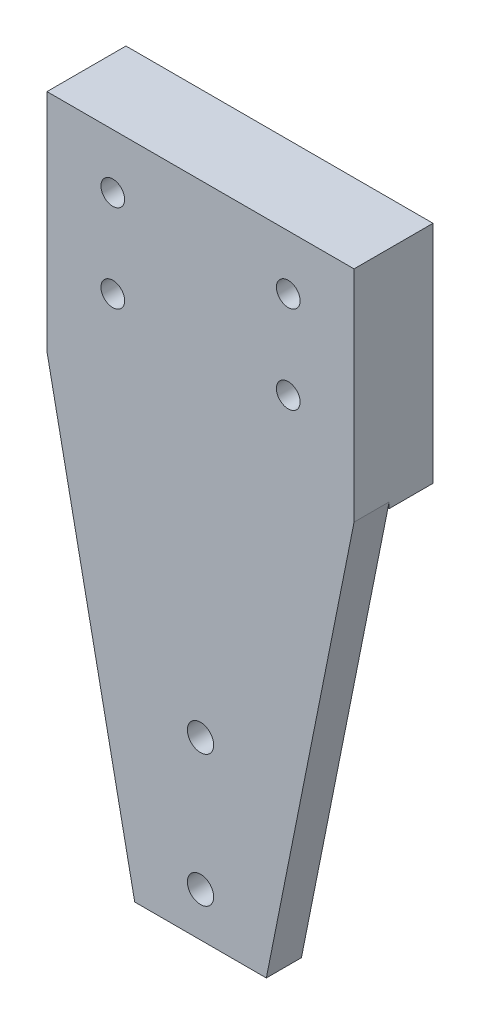
ISO-10303-21;
HEADER;
FILE_DESCRIPTION(('STEP AP214'),'2;1');
FILE_NAME('part.step','',(''),(''),'','','');
FILE_SCHEMA(('AUTOMOTIVE_DESIGN { 1 0 10303 214 1 1 1 1 }'));
ENDSEC;
DATA;
#1=APPLICATION_CONTEXT('core data for automotive mechanical design processes');
#2=APPLICATION_PROTOCOL_DEFINITION('international standard','automotive_design',2000,#1);
#3=PRODUCT_CONTEXT('',#1,'mechanical');
#4=PRODUCT('Part','Part','',(#3));
#5=PRODUCT_RELATED_PRODUCT_CATEGORY('part','',(#4));
#6=PRODUCT_DEFINITION_FORMATION('','',#4);
#7=PRODUCT_DEFINITION_CONTEXT('part definition',#1,'design');
#8=PRODUCT_DEFINITION('design','',#6,#7);
#9=PRODUCT_DEFINITION_SHAPE('','',#8);
#10=(LENGTH_UNIT() NAMED_UNIT(*) SI_UNIT(.MILLI.,.METRE.));
#11=(NAMED_UNIT(*) PLANE_ANGLE_UNIT() SI_UNIT($,.RADIAN.));
#12=(NAMED_UNIT(*) SI_UNIT($,.STERADIAN.) SOLID_ANGLE_UNIT());
#13=UNCERTAINTY_MEASURE_WITH_UNIT(LENGTH_MEASURE(1.E-05),#10,'distance_accuracy_value','');
#14=(GEOMETRIC_REPRESENTATION_CONTEXT(3) GLOBAL_UNCERTAINTY_ASSIGNED_CONTEXT((#13)) GLOBAL_UNIT_ASSIGNED_CONTEXT((#10,
#11,#12)) REPRESENTATION_CONTEXT('',''));
#15=CARTESIAN_POINT('',(0.,0.,0.));
#16=DIRECTION('',(0.,0.,1.));
#17=DIRECTION('',(1.,0.,0.));
#18=AXIS2_PLACEMENT_3D('',#15,#16,#17);
#19=CARTESIAN_POINT('',(0.,0.,0.));
#20=DIRECTION('',(0.,0.,1.));
#21=DIRECTION('',(1.,0.,0.));
#22=AXIS2_PLACEMENT_3D('',#19,#20,#21);
#23=PLANE('',#22);
#24=CARTESIAN_POINT('',(19.05,12.7,0.));
#25=DIRECTION('',(0.,0.,1.));
#26=DIRECTION('',(1.,0.,0.));
#27=AXIS2_PLACEMENT_3D('',#24,#25,#26);
#28=CIRCLE('',#27,3.81);
#29=CARTESIAN_POINT('',(22.86,12.7,0.));
#30=VERTEX_POINT('',#29);
#31=EDGE_CURVE('E292',#30,#30,#28,.T.);
#32=ORIENTED_EDGE('',*,*,#31,.T.);
#33=EDGE_LOOP('',(#32));
#34=FACE_BOUND('',#33,.T.);
#35=CARTESIAN_POINT('',(19.05,50.8,0.));
#36=DIRECTION('',(0.,0.,1.));
#37=DIRECTION('',(1.,0.,0.));
#38=AXIS2_PLACEMENT_3D('',#35,#36,#37);
#39=CIRCLE('',#38,3.81);
#40=CARTESIAN_POINT('',(22.86,50.8,0.));
#41=VERTEX_POINT('',#40);
#42=EDGE_CURVE('E301',#41,#41,#39,.T.);
#43=ORIENTED_EDGE('',*,*,#42,.T.);
#44=EDGE_LOOP('',(#43));
#45=FACE_BOUND('',#44,.T.);
#46=DIRECTION('',(-1.,0.,0.));
#47=VECTOR('',#46,1.);
#48=CARTESIAN_POINT('',(63.5,125.291623319093,0.));
#49=LINE('',#48,#47);
#50=CARTESIAN_POINT('',(63.1583246638187,125.291623319093,0.));
#51=VERTEX_POINT('',#50);
#52=CARTESIAN_POINT('',(-25.4,125.291623319093,0.));
#53=VERTEX_POINT('',#52);
#54=EDGE_CURVE('E12',#51,#53,#49,.T.);
#55=ORIENTED_EDGE('',*,*,#54,.F.);
#56=DIRECTION('',(0.196116135138184,0.98058067569092,0.));
#57=VECTOR('',#56,1.);
#58=CARTESIAN_POINT('',(38.1,0.,0.));
#59=LINE('',#58,#57);
#60=CARTESIAN_POINT('',(38.1,0.,0.));
#61=VERTEX_POINT('',#60);
#62=EDGE_CURVE('E260',#61,#51,#59,.T.);
#63=ORIENTED_EDGE('',*,*,#62,.F.);
#64=DIRECTION('',(1.,0.,0.));
#65=VECTOR('',#64,1.);
#66=CARTESIAN_POINT('',(0.,0.,0.));
#67=LINE('',#66,#65);
#68=CARTESIAN_POINT('',(0.,0.,0.));
#69=VERTEX_POINT('',#68);
#70=EDGE_CURVE('E257',#69,#61,#67,.T.);
#71=ORIENTED_EDGE('',*,*,#70,.F.);
#72=DIRECTION('',(0.198685338977704,-0.98006333268586,0.));
#73=VECTOR('',#72,1.);
#74=CARTESIAN_POINT('',(-25.4,125.291623319093,0.));
#75=LINE('',#74,#73);
#76=EDGE_CURVE('E255',#53,#69,#75,.T.);
#77=ORIENTED_EDGE('',*,*,#76,.F.);
#78=EDGE_LOOP('',(#55,#63,#71,#77));
#79=FACE_BOUND('',#78,.T.);
#80=ADVANCED_FACE('F167',(#34,#45,#79),#23,.F.);
#81=CARTESIAN_POINT('',(0.,0.,10.16));
#82=DIRECTION('',(0.,0.,1.));
#83=DIRECTION('',(1.,0.,0.));
#84=AXIS2_PLACEMENT_3D('',#81,#82,#83);
#85=PLANE('',#84);
#86=CARTESIAN_POINT('',(19.05,50.8,10.16));
#87=DIRECTION('',(0.,0.,1.));
#88=DIRECTION('',(1.,0.,0.));
#89=AXIS2_PLACEMENT_3D('',#86,#87,#88);
#90=CIRCLE('',#89,3.81);
#91=CARTESIAN_POINT('',(22.86,50.8,10.16));
#92=VERTEX_POINT('',#91);
#93=EDGE_CURVE('E304',#92,#92,#90,.T.);
#94=ORIENTED_EDGE('',*,*,#93,.F.);
#95=EDGE_LOOP('',(#94));
#96=FACE_BOUND('',#95,.T.);
#97=CARTESIAN_POINT('',(44.45,149.287730395854,10.16));
#98=DIRECTION('',(0.,0.,-1.));
#99=DIRECTION('',(-1.,0.,0.));
#100=AXIS2_PLACEMENT_3D('',#97,#98,#99);
#101=CIRCLE('',#100,3.42899999999998);
#102=CARTESIAN_POINT('',(41.021,149.287730395854,10.16));
#103=VERTEX_POINT('',#102);
#104=EDGE_CURVE('E307',#103,#103,#101,.T.);
#105=ORIENTED_EDGE('',*,*,#104,.T.);
#106=EDGE_LOOP('',(#105));
#107=FACE_BOUND('',#106,.T.);
#108=CARTESIAN_POINT('',(44.45,174.687730395854,10.16));
#109=DIRECTION('',(0.,0.,-1.));
#110=DIRECTION('',(-1.,0.,0.));
#111=AXIS2_PLACEMENT_3D('',#108,#109,#110);
#112=CIRCLE('',#111,3.42899999999998);
#113=CARTESIAN_POINT('',(41.021,174.687730395854,10.16));
#114=VERTEX_POINT('',#113);
#115=EDGE_CURVE('E312',#114,#114,#112,.T.);
#116=ORIENTED_EDGE('',*,*,#115,.T.);
#117=EDGE_LOOP('',(#116));
#118=FACE_BOUND('',#117,.T.);
#119=CARTESIAN_POINT('',(-6.35,174.687730395854,10.16));
#120=DIRECTION('',(0.,0.,1.));
#121=DIRECTION('',(1.,0.,0.));
#122=AXIS2_PLACEMENT_3D('',#119,#120,#121);
#123=CIRCLE('',#122,3.42899999999999);
#124=CARTESIAN_POINT('',(-2.92100000000001,174.687730395854,10.16));
#125=VERTEX_POINT('',#124);
#126=EDGE_CURVE('E258',#125,#125,#123,.T.);
#127=ORIENTED_EDGE('',*,*,#126,.F.);
#128=EDGE_LOOP('',(#127));
#129=FACE_BOUND('',#128,.T.);
#130=DIRECTION('',(0.,-1.,0.));
#131=VECTOR('',#130,1.);
#132=CARTESIAN_POINT('',(-25.4,190.5,10.16));
#133=LINE('',#132,#131);
#134=CARTESIAN_POINT('',(-25.4,190.5,10.16));
#135=VERTEX_POINT('',#134);
#136=CARTESIAN_POINT('',(-25.4,125.291623319093,10.16));
#137=VERTEX_POINT('',#136);
#138=EDGE_CURVE('E262',#135,#137,#133,.T.);
#139=ORIENTED_EDGE('',*,*,#138,.T.);
#140=DIRECTION('',(0.198685338977704,-0.98006333268586,0.));
#141=VECTOR('',#140,1.);
#142=CARTESIAN_POINT('',(-25.4,125.291623319093,10.16));
#143=LINE('',#142,#141);
#144=CARTESIAN_POINT('',(0.,0.,10.16));
#145=VERTEX_POINT('',#144);
#146=EDGE_CURVE('E218',#137,#145,#143,.T.);
#147=ORIENTED_EDGE('',*,*,#146,.T.);
#148=DIRECTION('',(1.,0.,0.));
#149=VECTOR('',#148,1.);
#150=CARTESIAN_POINT('',(0.,0.,10.16));
#151=LINE('',#150,#149);
#152=CARTESIAN_POINT('',(38.1,0.,10.16));
#153=VERTEX_POINT('',#152);
#154=EDGE_CURVE('E235',#145,#153,#151,.T.);
#155=ORIENTED_EDGE('',*,*,#154,.T.);
#156=DIRECTION('',(0.196116135138184,0.98058067569092,0.));
#157=VECTOR('',#156,1.);
#158=CARTESIAN_POINT('',(38.1,0.,10.16));
#159=LINE('',#158,#157);
#160=CARTESIAN_POINT('',(63.5,127.,10.16));
#161=VERTEX_POINT('',#160);
#162=EDGE_CURVE('E228',#153,#161,#159,.T.);
#163=ORIENTED_EDGE('',*,*,#162,.T.);
#164=DIRECTION('',(0.,1.,0.));
#165=VECTOR('',#164,1.);
#166=CARTESIAN_POINT('',(63.5,127.,10.16));
#167=LINE('',#166,#165);
#168=CARTESIAN_POINT('',(63.5,190.5,10.16));
#169=VERTEX_POINT('',#168);
#170=EDGE_CURVE('E232',#161,#169,#167,.T.);
#171=ORIENTED_EDGE('',*,*,#170,.T.);
#172=DIRECTION('',(-1.,0.,0.));
#173=VECTOR('',#172,1.);
#174=CARTESIAN_POINT('',(63.5,190.5,10.16));
#175=LINE('',#174,#173);
#176=EDGE_CURVE('E191',#169,#135,#175,.T.);
#177=ORIENTED_EDGE('',*,*,#176,.T.);
#178=EDGE_LOOP('',(#139,#147,#155,#163,#171,#177));
#179=FACE_BOUND('',#178,.T.);
#180=CARTESIAN_POINT('',(-6.35,149.287730395854,10.16));
#181=DIRECTION('',(0.,0.,1.));
#182=DIRECTION('',(1.,0.,0.));
#183=AXIS2_PLACEMENT_3D('',#180,#181,#182);
#184=CIRCLE('',#183,3.42899999999999);
#185=CARTESIAN_POINT('',(-2.92100000000001,149.287730395854,10.16));
#186=VERTEX_POINT('',#185);
#187=EDGE_CURVE('E315',#186,#186,#184,.T.);
#188=ORIENTED_EDGE('',*,*,#187,.F.);
#189=EDGE_LOOP('',(#188));
#190=FACE_BOUND('',#189,.T.);
#191=CARTESIAN_POINT('',(19.05,12.7,10.16));
#192=DIRECTION('',(0.,0.,1.));
#193=DIRECTION('',(1.,0.,0.));
#194=AXIS2_PLACEMENT_3D('',#191,#192,#193);
#195=CIRCLE('',#194,3.81);
#196=CARTESIAN_POINT('',(22.86,12.7,10.16));
#197=VERTEX_POINT('',#196);
#198=EDGE_CURVE('E298',#197,#197,#195,.T.);
#199=ORIENTED_EDGE('',*,*,#198,.F.);
#200=EDGE_LOOP('',(#199));
#201=FACE_BOUND('',#200,.T.);
#202=ADVANCED_FACE('F229',(#96,#107,#118,#129,#179,#190,#201),#85,.T.);
#203=CARTESIAN_POINT('',(-25.4,190.5,10.16));
#204=DIRECTION('',(1.,0.,0.));
#205=DIRECTION('',(0.,1.,0.));
#206=AXIS2_PLACEMENT_3D('',#203,#204,#205);
#207=PLANE('',#206);
#208=DIRECTION('',(0.,0.,-1.));
#209=VECTOR('',#208,1.);
#210=CARTESIAN_POINT('',(-25.4,190.5,10.16));
#211=LINE('',#210,#209);
#212=CARTESIAN_POINT('',(-25.4,190.5,-12.7));
#213=VERTEX_POINT('',#212);
#214=EDGE_CURVE('E251',#135,#213,#211,.T.);
#215=ORIENTED_EDGE('',*,*,#214,.T.);
#216=DIRECTION('',(0.,1.,0.));
#217=VECTOR('',#216,1.);
#218=CARTESIAN_POINT('',(-25.4,190.5,-12.7));
#219=LINE('',#218,#217);
#220=CARTESIAN_POINT('',(-25.4,125.291623319093,-12.7));
#221=VERTEX_POINT('',#220);
#222=EDGE_CURVE('E288',#221,#213,#219,.T.);
#223=ORIENTED_EDGE('',*,*,#222,.F.);
#224=DIRECTION('',(0.,0.,1.));
#225=VECTOR('',#224,1.);
#226=CARTESIAN_POINT('',(-25.4,125.291623319093,-12.7));
#227=LINE('',#226,#225);
#228=EDGE_CURVE('E283',#221,#53,#227,.T.);
#229=ORIENTED_EDGE('',*,*,#228,.T.);
#230=DIRECTION('',(0.,0.,-1.));
#231=VECTOR('',#230,1.);
#232=CARTESIAN_POINT('',(-25.4,125.291623319093,10.16));
#233=LINE('',#232,#231);
#234=EDGE_CURVE('E171',#137,#53,#233,.T.);
#235=ORIENTED_EDGE('',*,*,#234,.F.);
#236=ORIENTED_EDGE('',*,*,#138,.F.);
#237=EDGE_LOOP('',(#215,#223,#229,#235,#236));
#238=FACE_BOUND('',#237,.T.);
#239=ADVANCED_FACE('F169',(#238),#207,.F.);
#240=CARTESIAN_POINT('',(-25.4,125.291623319093,10.16));
#241=DIRECTION('',(0.98006333268586,0.198685338977704,0.));
#242=DIRECTION('',(-0.198685338977704,0.98006333268586,0.));
#243=AXIS2_PLACEMENT_3D('',#240,#241,#242);
#244=PLANE('',#243);
#245=ORIENTED_EDGE('',*,*,#76,.T.);
#246=DIRECTION('',(0.,0.,-1.));
#247=VECTOR('',#246,1.);
#248=CARTESIAN_POINT('',(0.,0.,10.16));
#249=LINE('',#248,#247);
#250=EDGE_CURVE('E266',#145,#69,#249,.T.);
#251=ORIENTED_EDGE('',*,*,#250,.F.);
#252=ORIENTED_EDGE('',*,*,#146,.F.);
#253=ORIENTED_EDGE('',*,*,#234,.T.);
#254=EDGE_LOOP('',(#245,#251,#252,#253));
#255=FACE_BOUND('',#254,.T.);
#256=ADVANCED_FACE('F271',(#255),#244,.F.);
#257=CARTESIAN_POINT('',(0.,0.,10.16));
#258=DIRECTION('',(0.,1.,0.));
#259=DIRECTION('',(0.,0.,1.));
#260=AXIS2_PLACEMENT_3D('',#257,#258,#259);
#261=PLANE('',#260);
#262=ORIENTED_EDGE('',*,*,#70,.T.);
#263=DIRECTION('',(0.,0.,-1.));
#264=VECTOR('',#263,1.);
#265=CARTESIAN_POINT('',(38.1,0.,10.16));
#266=LINE('',#265,#264);
#267=EDGE_CURVE('E244',#153,#61,#266,.T.);
#268=ORIENTED_EDGE('',*,*,#267,.F.);
#269=ORIENTED_EDGE('',*,*,#154,.F.);
#270=ORIENTED_EDGE('',*,*,#250,.T.);
#271=EDGE_LOOP('',(#262,#268,#269,#270));
#272=FACE_BOUND('',#271,.T.);
#273=ADVANCED_FACE('F321',(#272),#261,.F.);
#274=CARTESIAN_POINT('',(38.1,0.,10.16));
#275=DIRECTION('',(-0.98058067569092,0.196116135138184,0.));
#276=DIRECTION('',(-0.196116135138184,-0.98058067569092,0.));
#277=AXIS2_PLACEMENT_3D('',#274,#275,#276);
#278=PLANE('',#277);
#279=ORIENTED_EDGE('',*,*,#62,.T.);
#280=CARTESIAN_POINT('',(63.5,127.,0.));
#281=VERTEX_POINT('',#280);
#282=EDGE_CURVE('E209',#51,#281,#59,.T.);
#283=ORIENTED_EDGE('',*,*,#282,.T.);
#284=DIRECTION('',(0.,0.,-1.));
#285=VECTOR('',#284,1.);
#286=CARTESIAN_POINT('',(63.5,127.,10.16));
#287=LINE('',#286,#285);
#288=EDGE_CURVE('E239',#161,#281,#287,.T.);
#289=ORIENTED_EDGE('',*,*,#288,.F.);
#290=ORIENTED_EDGE('',*,*,#162,.F.);
#291=ORIENTED_EDGE('',*,*,#267,.T.);
#292=EDGE_LOOP('',(#279,#283,#289,#290,#291));
#293=FACE_BOUND('',#292,.T.);
#294=ADVANCED_FACE('F240',(#293),#278,.F.);
#295=CARTESIAN_POINT('',(63.5,127.,10.16));
#296=DIRECTION('',(-1.,0.,0.));
#297=DIRECTION('',(0.,0.,1.));
#298=AXIS2_PLACEMENT_3D('',#295,#296,#297);
#299=PLANE('',#298);
#300=ORIENTED_EDGE('',*,*,#288,.T.);
#301=DIRECTION('',(0.,-1.,0.));
#302=VECTOR('',#301,1.);
#303=CARTESIAN_POINT('',(63.5,190.5,0.));
#304=LINE('',#303,#302);
#305=CARTESIAN_POINT('',(63.5,125.291623319093,0.));
#306=VERTEX_POINT('',#305);
#307=EDGE_CURVE('E324',#281,#306,#304,.T.);
#308=ORIENTED_EDGE('',*,*,#307,.T.);
#309=DIRECTION('',(0.,0.,1.));
#310=VECTOR('',#309,1.);
#311=CARTESIAN_POINT('',(63.5,125.291623319093,-12.7));
#312=LINE('',#311,#310);
#313=CARTESIAN_POINT('',(63.5,125.291623319093,-12.7));
#314=VERTEX_POINT('',#313);
#315=EDGE_CURVE('E289',#314,#306,#312,.T.);
#316=ORIENTED_EDGE('',*,*,#315,.F.);
#317=DIRECTION('',(0.,-1.,0.));
#318=VECTOR('',#317,1.);
#319=CARTESIAN_POINT('',(63.5,190.5,-12.7));
#320=LINE('',#319,#318);
#321=CARTESIAN_POINT('',(63.5,190.5,-12.7));
#322=VERTEX_POINT('',#321);
#323=EDGE_CURVE('E327',#322,#314,#320,.T.);
#324=ORIENTED_EDGE('',*,*,#323,.F.);
#325=DIRECTION('',(0.,0.,-1.));
#326=VECTOR('',#325,1.);
#327=CARTESIAN_POINT('',(63.5,190.5,10.16));
#328=LINE('',#327,#326);
#329=EDGE_CURVE('E245',#169,#322,#328,.T.);
#330=ORIENTED_EDGE('',*,*,#329,.F.);
#331=ORIENTED_EDGE('',*,*,#170,.F.);
#332=EDGE_LOOP('',(#300,#308,#316,#324,#330,#331));
#333=FACE_BOUND('',#332,.T.);
#334=ADVANCED_FACE('F247',(#333),#299,.F.);
#335=CARTESIAN_POINT('',(63.5,190.5,10.16));
#336=DIRECTION('',(0.,-1.,0.));
#337=DIRECTION('',(0.,0.,-1.));
#338=AXIS2_PLACEMENT_3D('',#335,#336,#337);
#339=PLANE('',#338);
#340=ORIENTED_EDGE('',*,*,#329,.T.);
#341=DIRECTION('',(1.,0.,0.));
#342=VECTOR('',#341,1.);
#343=CARTESIAN_POINT('',(63.5,190.5,-12.7));
#344=LINE('',#343,#342);
#345=EDGE_CURVE('E290',#213,#322,#344,.T.);
#346=ORIENTED_EDGE('',*,*,#345,.F.);
#347=ORIENTED_EDGE('',*,*,#214,.F.);
#348=ORIENTED_EDGE('',*,*,#176,.F.);
#349=EDGE_LOOP('',(#340,#346,#347,#348));
#350=FACE_BOUND('',#349,.T.);
#351=ADVANCED_FACE('F363',(#350),#339,.F.);
#352=CARTESIAN_POINT('',(-6.35,174.687730395854,10.16));
#353=DIRECTION('',(0.,0.,-1.));
#354=DIRECTION('',(-1.,0.,0.));
#355=AXIS2_PLACEMENT_3D('',#352,#353,#354);
#356=CYLINDRICAL_SURFACE('',#355,3.42899999999999);
#357=ORIENTED_EDGE('',*,*,#126,.T.);
#358=EDGE_LOOP('',(#357));
#359=FACE_BOUND('',#358,.T.);
#360=CARTESIAN_POINT('',(-6.35,174.687730395854,-12.7));
#361=DIRECTION('',(0.,0.,-1.));
#362=DIRECTION('',(-1.,0.,0.));
#363=AXIS2_PLACEMENT_3D('',#360,#361,#362);
#364=CIRCLE('',#363,3.42899999999999);
#365=CARTESIAN_POINT('',(-9.779,174.687730395854,-12.7));
#366=VERTEX_POINT('',#365);
#367=EDGE_CURVE('E326',#366,#366,#364,.T.);
#368=ORIENTED_EDGE('',*,*,#367,.T.);
#369=EDGE_LOOP('',(#368));
#370=FACE_BOUND('',#369,.T.);
#371=ADVANCED_FACE('F365',(#359,#370),#356,.F.);
#372=CARTESIAN_POINT('',(-6.35,149.287730395854,10.16));
#373=DIRECTION('',(0.,0.,-1.));
#374=DIRECTION('',(-1.,0.,0.));
#375=AXIS2_PLACEMENT_3D('',#372,#373,#374);
#376=CYLINDRICAL_SURFACE('',#375,3.42899999999999);
#377=ORIENTED_EDGE('',*,*,#187,.T.);
#378=EDGE_LOOP('',(#377));
#379=FACE_BOUND('',#378,.T.);
#380=CARTESIAN_POINT('',(-6.35,149.287730395854,-12.7));
#381=DIRECTION('',(0.,0.,-1.));
#382=DIRECTION('',(-1.,0.,0.));
#383=AXIS2_PLACEMENT_3D('',#380,#381,#382);
#384=CIRCLE('',#383,3.42899999999999);
#385=CARTESIAN_POINT('',(-9.779,149.287730395854,-12.7));
#386=VERTEX_POINT('',#385);
#387=EDGE_CURVE('E338',#386,#386,#384,.T.);
#388=ORIENTED_EDGE('',*,*,#387,.T.);
#389=EDGE_LOOP('',(#388));
#390=FACE_BOUND('',#389,.T.);
#391=ADVANCED_FACE('F372',(#379,#390),#376,.F.);
#392=CARTESIAN_POINT('',(44.45,174.687730395854,10.16));
#393=DIRECTION('',(0.,0.,-1.));
#394=DIRECTION('',(-1.,0.,0.));
#395=AXIS2_PLACEMENT_3D('',#392,#393,#394);
#396=CYLINDRICAL_SURFACE('',#395,3.42899999999998);
#397=ORIENTED_EDGE('',*,*,#115,.F.);
#398=EDGE_LOOP('',(#397));
#399=FACE_BOUND('',#398,.T.);
#400=CARTESIAN_POINT('',(44.45,174.687730395854,-12.7));
#401=DIRECTION('',(0.,0.,-1.));
#402=DIRECTION('',(-1.,0.,0.));
#403=AXIS2_PLACEMENT_3D('',#400,#401,#402);
#404=CIRCLE('',#403,3.42899999999998);
#405=CARTESIAN_POINT('',(41.021,174.687730395854,-12.7));
#406=VERTEX_POINT('',#405);
#407=EDGE_CURVE('E329',#406,#406,#404,.T.);
#408=ORIENTED_EDGE('',*,*,#407,.T.);
#409=EDGE_LOOP('',(#408));
#410=FACE_BOUND('',#409,.T.);
#411=ADVANCED_FACE('F347',(#399,#410),#396,.F.);
#412=CARTESIAN_POINT('',(44.45,149.287730395854,10.16));
#413=DIRECTION('',(0.,0.,-1.));
#414=DIRECTION('',(-1.,0.,0.));
#415=AXIS2_PLACEMENT_3D('',#412,#413,#414);
#416=CYLINDRICAL_SURFACE('',#415,3.42899999999998);
#417=ORIENTED_EDGE('',*,*,#104,.F.);
#418=EDGE_LOOP('',(#417));
#419=FACE_BOUND('',#418,.T.);
#420=CARTESIAN_POINT('',(44.45,149.287730395854,-12.7));
#421=DIRECTION('',(0.,0.,-1.));
#422=DIRECTION('',(-1.,0.,0.));
#423=AXIS2_PLACEMENT_3D('',#420,#421,#422);
#424=CIRCLE('',#423,3.42899999999998);
#425=CARTESIAN_POINT('',(41.021,149.287730395854,-12.7));
#426=VERTEX_POINT('',#425);
#427=EDGE_CURVE('E341',#426,#426,#424,.T.);
#428=ORIENTED_EDGE('',*,*,#427,.T.);
#429=EDGE_LOOP('',(#428));
#430=FACE_BOUND('',#429,.T.);
#431=ADVANCED_FACE('F393',(#419,#430),#416,.F.);
#432=CARTESIAN_POINT('',(19.05,50.8,10.16));
#433=DIRECTION('',(0.,0.,-1.));
#434=DIRECTION('',(-1.,0.,0.));
#435=AXIS2_PLACEMENT_3D('',#432,#433,#434);
#436=CYLINDRICAL_SURFACE('',#435,3.81);
#437=ORIENTED_EDGE('',*,*,#93,.T.);
#438=EDGE_LOOP('',(#437));
#439=FACE_BOUND('',#438,.T.);
#440=ORIENTED_EDGE('',*,*,#42,.F.);
#441=EDGE_LOOP('',(#440));
#442=FACE_BOUND('',#441,.T.);
#443=ADVANCED_FACE('F397',(#439,#442),#436,.F.);
#444=CARTESIAN_POINT('',(19.05,12.7,10.16));
#445=DIRECTION('',(0.,0.,-1.));
#446=DIRECTION('',(-1.,0.,0.));
#447=AXIS2_PLACEMENT_3D('',#444,#445,#446);
#448=CYLINDRICAL_SURFACE('',#447,3.81);
#449=ORIENTED_EDGE('',*,*,#198,.T.);
#450=EDGE_LOOP('',(#449));
#451=FACE_BOUND('',#450,.T.);
#452=ORIENTED_EDGE('',*,*,#31,.F.);
#453=EDGE_LOOP('',(#452));
#454=FACE_BOUND('',#453,.T.);
#455=ADVANCED_FACE('F401',(#451,#454),#448,.F.);
#456=CARTESIAN_POINT('',(0.,0.,0.));
#457=DIRECTION('',(0.,0.,-1.));
#458=DIRECTION('',(-1.,0.,0.));
#459=AXIS2_PLACEMENT_3D('',#456,#457,#458);
#460=PLANE('',#459);
#461=ORIENTED_EDGE('',*,*,#282,.F.);
#462=EDGE_CURVE('E177',#306,#51,#49,.T.);
#463=ORIENTED_EDGE('',*,*,#462,.F.);
#464=ORIENTED_EDGE('',*,*,#307,.F.);
#465=EDGE_LOOP('',(#461,#463,#464));
#466=FACE_BOUND('',#465,.T.);
#467=ADVANCED_FACE('F323',(#466),#460,.F.);
#468=CARTESIAN_POINT('',(0.,0.,-12.7));
#469=DIRECTION('',(0.,0.,-1.));
#470=DIRECTION('',(-1.,0.,0.));
#471=AXIS2_PLACEMENT_3D('',#468,#469,#470);
#472=PLANE('',#471);
#473=ORIENTED_EDGE('',*,*,#387,.F.);
#474=EDGE_LOOP('',(#473));
#475=FACE_BOUND('',#474,.T.);
#476=ORIENTED_EDGE('',*,*,#427,.F.);
#477=EDGE_LOOP('',(#476));
#478=FACE_BOUND('',#477,.T.);
#479=ORIENTED_EDGE('',*,*,#407,.F.);
#480=EDGE_LOOP('',(#479));
#481=FACE_BOUND('',#480,.T.);
#482=ORIENTED_EDGE('',*,*,#367,.F.);
#483=EDGE_LOOP('',(#482));
#484=FACE_BOUND('',#483,.T.);
#485=ORIENTED_EDGE('',*,*,#323,.T.);
#486=DIRECTION('',(-1.,0.,0.));
#487=VECTOR('',#486,1.);
#488=CARTESIAN_POINT('',(63.5,125.291623319093,-12.7));
#489=LINE('',#488,#487);
#490=EDGE_CURVE('E333',#314,#221,#489,.T.);
#491=ORIENTED_EDGE('',*,*,#490,.T.);
#492=ORIENTED_EDGE('',*,*,#222,.T.);
#493=ORIENTED_EDGE('',*,*,#345,.T.);
#494=EDGE_LOOP('',(#485,#491,#492,#493));
#495=FACE_BOUND('',#494,.T.);
#496=ADVANCED_FACE('F349',(#475,#478,#481,#484,#495),#472,.T.);
#497=CARTESIAN_POINT('',(63.5,125.291623319093,-12.7));
#498=DIRECTION('',(0.,1.,0.));
#499=DIRECTION('',(0.,0.,1.));
#500=AXIS2_PLACEMENT_3D('',#497,#498,#499);
#501=PLANE('',#500);
#502=ORIENTED_EDGE('',*,*,#462,.T.);
#503=ORIENTED_EDGE('',*,*,#54,.T.);
#504=ORIENTED_EDGE('',*,*,#228,.F.);
#505=ORIENTED_EDGE('',*,*,#490,.F.);
#506=ORIENTED_EDGE('',*,*,#315,.T.);
#507=EDGE_LOOP('',(#502,#503,#504,#505,#506));
#508=FACE_BOUND('',#507,.T.);
#509=ADVANCED_FACE('F280',(#508),#501,.F.);
#510=CLOSED_SHELL('',(#80,#202,#239,#256,#273,#294,#334,#351,#371,#391,#411,#431,#443,#455,#467,
#496,#509));
#511=MANIFOLD_SOLID_BREP('B2',#510);
#512=ADVANCED_BREP_SHAPE_REPRESENTATION('',(#18,#511),#14);
#513=SHAPE_DEFINITION_REPRESENTATION(#9,#512);
ENDSEC;
END-ISO-10303-21;
